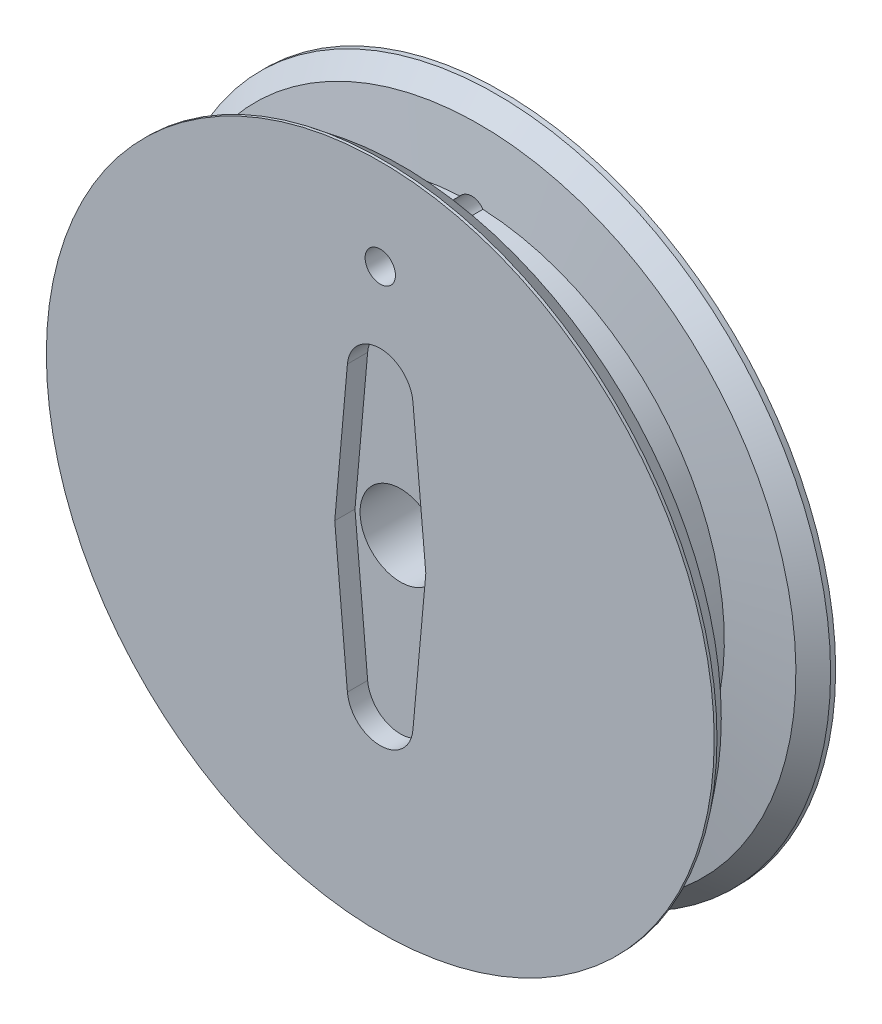
ISO-10303-21;
HEADER;
FILE_DESCRIPTION(('STEP AP214'),'2;1');
FILE_NAME('part.step','',(''),(''),'','','');
FILE_SCHEMA(('AUTOMOTIVE_DESIGN { 1 0 10303 214 1 1 1 1 }'));
ENDSEC;
DATA;
#1=APPLICATION_CONTEXT('core data for automotive mechanical design processes');
#2=APPLICATION_PROTOCOL_DEFINITION('international standard','automotive_design',2000,#1);
#3=PRODUCT_CONTEXT('',#1,'mechanical');
#4=PRODUCT('Part','Part','',(#3));
#5=PRODUCT_RELATED_PRODUCT_CATEGORY('part','',(#4));
#6=PRODUCT_DEFINITION_FORMATION('','',#4);
#7=PRODUCT_DEFINITION_CONTEXT('part definition',#1,'design');
#8=PRODUCT_DEFINITION('design','',#6,#7);
#9=PRODUCT_DEFINITION_SHAPE('','',#8);
#10=(LENGTH_UNIT() NAMED_UNIT(*) SI_UNIT(.MILLI.,.METRE.));
#11=(NAMED_UNIT(*) PLANE_ANGLE_UNIT() SI_UNIT($,.RADIAN.));
#12=(NAMED_UNIT(*) SI_UNIT($,.STERADIAN.) SOLID_ANGLE_UNIT());
#13=UNCERTAINTY_MEASURE_WITH_UNIT(LENGTH_MEASURE(1.E-05),#10,'distance_accuracy_value','');
#14=(GEOMETRIC_REPRESENTATION_CONTEXT(3) GLOBAL_UNCERTAINTY_ASSIGNED_CONTEXT((#13)) GLOBAL_UNIT_ASSIGNED_CONTEXT((#10,
#11,#12)) REPRESENTATION_CONTEXT('',''));
#15=CARTESIAN_POINT('',(0.,0.,0.));
#16=DIRECTION('',(0.,0.,1.));
#17=DIRECTION('',(1.,0.,0.));
#18=AXIS2_PLACEMENT_3D('',#15,#16,#17);
#19=CARTESIAN_POINT('',(0.,0.,-9.));
#20=DIRECTION('',(0.,0.,-1.));
#21=DIRECTION('',(1.,0.,0.));
#22=AXIS2_PLACEMENT_3D('',#19,#20,#21);
#23=CONICAL_SURFACE('',#22,25.,1.44644133224814);
#24=CARTESIAN_POINT('',(0.,0.,-9.78571428571429));
#25=DIRECTION('',(0.,0.,-1.));
#26=DIRECTION('',(-1.,0.,0.));
#27=AXIS2_PLACEMENT_3D('',#24,#25,#26);
#28=CIRCLE('',#27,31.2857142857143);
#29=CARTESIAN_POINT('',(-31.2857142857143,0.,-9.78571428571429));
#30=VERTEX_POINT('',#29);
#31=EDGE_CURVE('E110',#30,#30,#28,.T.);
#32=ORIENTED_EDGE('',*,*,#31,.F.);
#33=EDGE_LOOP('',(#32));
#34=FACE_BOUND('',#33,.T.);
#35=CARTESIAN_POINT('',(0.,0.,-9.));
#36=DIRECTION('',(0.,0.,-1.));
#37=DIRECTION('',(-1.,0.,0.));
#38=AXIS2_PLACEMENT_3D('',#35,#36,#37);
#39=CIRCLE('',#38,25.);
#40=CARTESIAN_POINT('',(1.14079146426094,24.9739583333333,-9.));
#41=VERTEX_POINT('',#40);
#42=CARTESIAN_POINT('',(-1.14079146426093,24.9739583333333,-9.));
#43=VERTEX_POINT('',#42);
#44=EDGE_CURVE('E128',#41,#43,#39,.T.);
#45=ORIENTED_EDGE('',*,*,#44,.T.);
#46=CARTESIAN_POINT('',(1.14221224438344,24.97229172,-8.9998));
#47=CARTESIAN_POINT('',(1.11497986690367,25.0042828360847,-9.00363918158181));
#48=CARTESIAN_POINT('',(1.08640729835014,25.0351245483507,-9.00733334676588));
#49=CARTESIAN_POINT('',(1.02675752938036,25.0943200766134,-9.01441217879698));
#50=CARTESIAN_POINT('',(0.995680364507312,25.1226739279041,-9.01779685003465));
#51=CARTESIAN_POINT('',(0.899043705848155,25.2036465298911,-9.02744866071762));
#52=CARTESIAN_POINT('',(0.83000261618446,25.2522659998382,-9.03322434045544));
#53=CARTESIAN_POINT('',(0.68465909844481,25.3372899282666,-9.04330384586843));
#54=CARTESIAN_POINT('',(0.608352216488604,25.3736868317178,-9.04760676122787));
#55=CARTESIAN_POINT('',(0.450659907044899,25.4331785596276,-9.05463088284024));
#56=CARTESIAN_POINT('',(0.369275846799599,25.4562769482748,-9.05735251290161));
#57=CARTESIAN_POINT('',(0.20408971927831,25.4884220230908,-9.06113816046542));
#58=CARTESIAN_POINT('',(0.120298892823023,25.4975257483435,-9.06220890665055));
#59=CARTESIAN_POINT('',(-0.0476366794566334,25.5015941563396,-9.06268755188312));
#60=CARTESIAN_POINT('',(-0.131781446504658,25.4965579787744,-9.06209534975242));
#61=CARTESIAN_POINT('',(-0.297781736777393,25.4725286688966,-9.05926674729419));
#62=CARTESIAN_POINT('',(-0.379643022020577,25.4535747465762,-9.05703496608884));
#63=CARTESIAN_POINT('',(-0.53904342146849,25.4022990633497,-9.0509864018234));
#64=CARTESIAN_POINT('',(-0.616580732776138,25.3699717729656,-9.04716896313986));
#65=CARTESIAN_POINT('',(-0.765296164565059,25.2928117916432,-9.03803429696399));
#66=CARTESIAN_POINT('',(-0.836457886371744,25.2479480098138,-9.03271334032771));
#67=CARTESIAN_POINT('',(-0.970114639775866,25.1471085224983,-9.02071507595263));
#68=CARTESIAN_POINT('',(-1.03262729614732,25.0911559969593,-9.01404059695576));
#69=CARTESIAN_POINT('',(-1.10789908944012,25.0115573442881,-9.00450945727498));
#70=CARTESIAN_POINT('',(-1.12532244620271,24.9921398851261,-9.00218194077337));
#71=CARTESIAN_POINT('',(-1.14221224438344,24.97229172,-8.9998));
#72=B_SPLINE_CURVE_WITH_KNOTS('',3,(#46,#47,#48,#49,#50,#51,#52,#53,#54,#55,#56,#57,#58,#59,#60,
#61,#62,#63,#64,#65,#66,#67,#68,#69,#70,#71),.UNSPECIFIED.,.F.,.F.,(4,2,2,2,2,2,2,2,2,2,2,2,4),
(0.,0.126485429937742,0.252969065212388,0.505585889405259,0.758358575279168,1.01106348295129,
1.26273566584856,1.51442316147279,1.76540429377413,2.01648930296785,2.26820262343231,
2.51939520861693,2.59793226541492),.UNSPECIFIED.);
#73=EDGE_CURVE('E119',#41,#43,#72,.T.);
#74=ORIENTED_EDGE('',*,*,#73,.F.);
#75=EDGE_LOOP('',(#45,#74));
#76=FACE_BOUND('',#75,.T.);
#77=ADVANCED_FACE('F41',(#34,#76),#23,.T.);
#78=CARTESIAN_POINT('',(0.,0.,0.));
#79=DIRECTION('',(0.,0.,1.));
#80=DIRECTION('',(-1.,0.,0.));
#81=AXIS2_PLACEMENT_3D('',#78,#79,#80);
#82=CYLINDRICAL_SURFACE('',#81,25.);
#83=CARTESIAN_POINT('',(0.,0.,-3.));
#84=DIRECTION('',(0.,0.,-1.));
#85=DIRECTION('',(-1.,0.,0.));
#86=AXIS2_PLACEMENT_3D('',#83,#84,#85);
#87=CIRCLE('',#86,25.);
#88=CARTESIAN_POINT('',(1.14079146426091,24.9739583333333,-3.));
#89=VERTEX_POINT('',#88);
#90=CARTESIAN_POINT('',(-1.1407914642609,24.9739583333333,-3.));
#91=VERTEX_POINT('',#90);
#92=EDGE_CURVE('E108',#89,#91,#87,.T.);
#93=ORIENTED_EDGE('',*,*,#92,.T.);
#94=DIRECTION('',(0.,0.,1.));
#95=VECTOR('',#94,1.);
#96=CARTESIAN_POINT('',(-1.14079146426093,24.9739583333333,-6.));
#97=LINE('',#96,#95);
#98=EDGE_CURVE('E114',#43,#91,#97,.T.);
#99=ORIENTED_EDGE('',*,*,#98,.F.);
#100=ORIENTED_EDGE('',*,*,#44,.F.);
#101=DIRECTION('',(0.,0.,1.));
#102=VECTOR('',#101,1.);
#103=CARTESIAN_POINT('',(1.14079146426093,24.9739583333333,-6.));
#104=LINE('',#103,#102);
#105=EDGE_CURVE('E122',#89,#41,#104,.F.);
#106=ORIENTED_EDGE('',*,*,#105,.F.);
#107=EDGE_LOOP('',(#93,#99,#100,#106));
#108=FACE_BOUND('',#107,.T.);
#109=ADVANCED_FACE('F124',(#108),#82,.T.);
#110=CARTESIAN_POINT('',(0.,0.,-2.));
#111=DIRECTION('',(0.,0.,1.));
#112=DIRECTION('',(-1.,0.,0.));
#113=AXIS2_PLACEMENT_3D('',#110,#111,#112);
#114=CONICAL_SURFACE('',#113,33.,1.44644133224813);
#115=CARTESIAN_POINT('',(0.,0.,-2.18605210188381));
#116=DIRECTION('',(0.,0.,1.));
#117=DIRECTION('',(1.,0.,0.));
#118=AXIS2_PLACEMENT_3D('',#115,#116,#117);
#119=CIRCLE('',#118,31.5115831849295);
#120=CARTESIAN_POINT('',(31.5115831849295,0.,-2.18605210188381));
#121=VERTEX_POINT('',#120);
#122=EDGE_CURVE('E11',#121,#121,#119,.T.);
#123=ORIENTED_EDGE('',*,*,#122,.F.);
#124=EDGE_LOOP('',(#123));
#125=FACE_BOUND('',#124,.T.);
#126=ORIENTED_EDGE('',*,*,#92,.F.);
#127=CARTESIAN_POINT('',(-1.14221224438344,24.97229172,-3.0002));
#128=CARTESIAN_POINT('',(-1.11497986690367,25.0042828360848,-2.9963608184182));
#129=CARTESIAN_POINT('',(-1.08640729835014,25.0351245483507,-2.99266665323413));
#130=CARTESIAN_POINT('',(-1.02675752938035,25.0943200766135,-2.98558782120302));
#131=CARTESIAN_POINT('',(-0.995680364507306,25.1226739279041,-2.98220314996536));
#132=CARTESIAN_POINT('',(-0.899043705848149,25.2036465298911,-2.97255133928238));
#133=CARTESIAN_POINT('',(-0.830002616184454,25.2522659998382,-2.96677565954456));
#134=CARTESIAN_POINT('',(-0.684659098444804,25.3372899282666,-2.95669615413158));
#135=CARTESIAN_POINT('',(-0.608352216488599,25.3736868317178,-2.95239323877214));
#136=CARTESIAN_POINT('',(-0.450659907044894,25.4331785596276,-2.94536911715977));
#137=CARTESIAN_POINT('',(-0.369275846799594,25.4562769482748,-2.94264748709839));
#138=CARTESIAN_POINT('',(-0.204089719278304,25.4884220230908,-2.93886183953458));
#139=CARTESIAN_POINT('',(-0.120298892823017,25.4975257483435,-2.93779109334945));
#140=CARTESIAN_POINT('',(0.047636679456639,25.5015941563396,-2.93731244811689));
#141=CARTESIAN_POINT('',(0.131781446504664,25.4965579787744,-2.93790465024759));
#142=CARTESIAN_POINT('',(0.297781736777398,25.4725286688966,-2.94073325270582));
#143=CARTESIAN_POINT('',(0.379643022020583,25.4535747465762,-2.94296503391117));
#144=CARTESIAN_POINT('',(0.539043421468495,25.4022990633497,-2.94901359817661));
#145=CARTESIAN_POINT('',(0.616580732776143,25.3699717729656,-2.95283103686014));
#146=CARTESIAN_POINT('',(0.765296164565063,25.2928117916432,-2.96196570303601));
#147=CARTESIAN_POINT('',(0.836457886371749,25.2479480098138,-2.9672866596723));
#148=CARTESIAN_POINT('',(0.97011463977587,25.1471085224983,-2.97928492404737));
#149=CARTESIAN_POINT('',(1.03262729614733,25.0911559969593,-2.98595940304424));
#150=CARTESIAN_POINT('',(1.10789908944012,25.0115573442881,-2.99549054272502));
#151=CARTESIAN_POINT('',(1.12532244620271,24.9921398851261,-2.99781805922663));
#152=CARTESIAN_POINT('',(1.14221224438344,24.97229172,-3.0002));
#153=B_SPLINE_CURVE_WITH_KNOTS('',3,(#127,#128,#129,#130,#131,#132,#133,#134,#135,#136,#137,
#138,#139,#140,#141,#142,#143,#144,#145,#146,#147,#148,#149,#150,#151,#152),.UNSPECIFIED.,.F.,
.F.,(4,2,2,2,2,2,2,2,2,2,2,2,4),(0.,0.126485429937743,0.252969065212389,0.505585889405258,
0.758358575279165,1.01106348295129,1.26273566584856,1.51442316147279,1.76540429377413,
2.01648930296784,2.26820262343231,2.51939520861693,2.5979322654149),.UNSPECIFIED.);
#154=EDGE_CURVE('E57',#91,#89,#153,.T.);
#155=ORIENTED_EDGE('',*,*,#154,.F.);
#156=EDGE_LOOP('',(#126,#155));
#157=FACE_BOUND('',#156,.T.);
#158=ADVANCED_FACE('F107',(#125,#157),#114,.T.);
#159=CARTESIAN_POINT('',(-33.,0.,0.));
#160=DIRECTION('',(0.,0.,1.));
#161=DIRECTION('',(-1.,0.,0.));
#162=AXIS2_PLACEMENT_3D('',#159,#160,#161);
#163=PLANE('',#162);
#164=CARTESIAN_POINT('',(0.,24.,0.));
#165=DIRECTION('',(0.,0.,1.));
#166=DIRECTION('',(1.,0.,0.));
#167=AXIS2_PLACEMENT_3D('',#164,#165,#166);
#168=CIRCLE('',#167,1.5);
#169=CARTESIAN_POINT('',(1.5,24.,0.));
#170=VERTEX_POINT('',#169);
#171=EDGE_CURVE('E404',#170,#170,#168,.T.);
#172=ORIENTED_EDGE('',*,*,#171,.F.);
#173=EDGE_LOOP('',(#172));
#174=FACE_BOUND('',#173,.T.);
#175=CARTESIAN_POINT('',(-0.011832825867151,-13.7500011355933,0.));
#176=DIRECTION('',(0.,0.,-1.));
#177=DIRECTION('',(1.,0.,0.));
#178=AXIS2_PLACEMENT_3D('',#175,#176,#177);
#179=CIRCLE('',#178,3.25);
#180=CARTESIAN_POINT('',(3.22485268695212,-14.0438835799581,0.));
#181=VERTEX_POINT('',#180);
#182=CARTESIAN_POINT('',(-3.24900516177154,-14.038471701952,0.));
#183=VERTEX_POINT('',#182);
#184=EDGE_CURVE('E171',#181,#183,#179,.T.);
#185=ORIENTED_EDGE('',*,*,#184,.T.);
#186=DIRECTION('',(-0.0887601742642085,0.996053026432121,0.));
#187=VECTOR('',#186,1.);
#188=CARTESIAN_POINT('',(-4.5,0.,0.));
#189=LINE('',#188,#187);
#190=CARTESIAN_POINT('',(-4.5,0.,0.));
#191=VERTEX_POINT('',#190);
#192=EDGE_CURVE('E192',#183,#191,#189,.T.);
#193=ORIENTED_EDGE('',*,*,#192,.T.);
#194=DIRECTION('',(0.0887601742642085,0.996053026432121,0.));
#195=VECTOR('',#194,1.);
#196=CARTESIAN_POINT('',(-4.5,0.,0.));
#197=LINE('',#196,#195);
#198=CARTESIAN_POINT('',(-3.24900516177154,14.038471701952,0.));
#199=VERTEX_POINT('',#198);
#200=EDGE_CURVE('E191',#191,#199,#197,.T.);
#201=ORIENTED_EDGE('',*,*,#200,.T.);
#202=CARTESIAN_POINT('',(-0.011832825867151,13.7500011355933,0.));
#203=DIRECTION('',(0.,0.,-1.));
#204=DIRECTION('',(-1.,0.,0.));
#205=AXIS2_PLACEMENT_3D('',#202,#203,#204);
#206=CIRCLE('',#205,3.25);
#207=CARTESIAN_POINT('',(3.22485268695212,14.0438835799581,0.));
#208=VERTEX_POINT('',#207);
#209=EDGE_CURVE('E197',#199,#208,#206,.T.);
#210=ORIENTED_EDGE('',*,*,#209,.T.);
#211=DIRECTION('',(0.0904253674968557,-0.995903234713624,0.));
#212=VECTOR('',#211,1.);
#213=CARTESIAN_POINT('',(3.22485268695212,14.0438835799581,0.));
#214=LINE('',#213,#212);
#215=CARTESIAN_POINT('',(4.5,0.,0.));
#216=VERTEX_POINT('',#215);
#217=EDGE_CURVE('E200',#208,#216,#214,.T.);
#218=ORIENTED_EDGE('',*,*,#217,.T.);
#219=DIRECTION('',(-0.0904253674968557,-0.995903234713624,0.));
#220=VECTOR('',#219,1.);
#221=CARTESIAN_POINT('',(3.22485268695212,-14.0438835799581,0.));
#222=LINE('',#221,#220);
#223=EDGE_CURVE('E177',#216,#181,#222,.T.);
#224=ORIENTED_EDGE('',*,*,#223,.T.);
#225=EDGE_LOOP('',(#185,#193,#201,#210,#218,#224));
#226=FACE_BOUND('',#225,.T.);
#227=CARTESIAN_POINT('',(0.,0.,0.));
#228=DIRECTION('',(0.,0.,-1.));
#229=DIRECTION('',(-1.,0.,0.));
#230=AXIS2_PLACEMENT_3D('',#227,#228,#229);
#231=CIRCLE('',#230,33.);
#232=CARTESIAN_POINT('',(-33.,0.,0.));
#233=VERTEX_POINT('',#232);
#234=EDGE_CURVE('E130',#233,#233,#231,.T.);
#235=ORIENTED_EDGE('',*,*,#234,.F.);
#236=EDGE_LOOP('',(#235));
#237=FACE_BOUND('',#236,.T.);
#238=ADVANCED_FACE('F148',(#174,#226,#237),#163,.T.);
#239=CARTESIAN_POINT('',(0.,0.,-12.));
#240=DIRECTION('',(0.,0.,-1.));
#241=DIRECTION('',(1.,0.,0.));
#242=AXIS2_PLACEMENT_3D('',#239,#240,#241);
#243=PLANE('',#242);
#244=CARTESIAN_POINT('',(0.,24.,-12.));
#245=DIRECTION('',(0.,0.,1.));
#246=DIRECTION('',(1.,0.,0.));
#247=AXIS2_PLACEMENT_3D('',#244,#245,#246);
#248=CIRCLE('',#247,1.5);
#249=CARTESIAN_POINT('',(1.5,24.,-12.));
#250=VERTEX_POINT('',#249);
#251=EDGE_CURVE('E121',#250,#250,#248,.T.);
#252=ORIENTED_EDGE('',*,*,#251,.T.);
#253=EDGE_LOOP('',(#252));
#254=FACE_BOUND('',#253,.T.);
#255=CARTESIAN_POINT('',(0.,0.,-12.));
#256=DIRECTION('',(0.,0.,-1.));
#257=DIRECTION('',(-1.,0.,0.));
#258=AXIS2_PLACEMENT_3D('',#255,#256,#257);
#259=CIRCLE('',#258,4.);
#260=CARTESIAN_POINT('',(-4.,0.,-12.));
#261=VERTEX_POINT('',#260);
#262=EDGE_CURVE('E169',#261,#261,#259,.T.);
#263=ORIENTED_EDGE('',*,*,#262,.F.);
#264=EDGE_LOOP('',(#263));
#265=FACE_BOUND('',#264,.T.);
#266=CARTESIAN_POINT('',(0.,0.,-12.));
#267=DIRECTION('',(0.,0.,-1.));
#268=DIRECTION('',(-1.,0.,0.));
#269=AXIS2_PLACEMENT_3D('',#266,#267,#268);
#270=CIRCLE('',#269,33.);
#271=CARTESIAN_POINT('',(-33.,0.,-12.));
#272=VERTEX_POINT('',#271);
#273=EDGE_CURVE('E112',#272,#272,#270,.T.);
#274=ORIENTED_EDGE('',*,*,#273,.T.);
#275=EDGE_LOOP('',(#274));
#276=FACE_BOUND('',#275,.T.);
#277=ADVANCED_FACE('F261',(#254,#265,#276),#243,.T.);
#278=CARTESIAN_POINT('',(0.,0.,0.));
#279=DIRECTION('',(0.,0.,1.));
#280=DIRECTION('',(-1.,0.,0.));
#281=AXIS2_PLACEMENT_3D('',#278,#279,#280);
#282=CYLINDRICAL_SURFACE('',#281,33.);
#283=CARTESIAN_POINT('',(0.,0.,-11.5));
#284=DIRECTION('',(0.,0.,-1.));
#285=DIRECTION('',(-1.,0.,0.));
#286=AXIS2_PLACEMENT_3D('',#283,#284,#285);
#287=CIRCLE('',#286,33.);
#288=CARTESIAN_POINT('',(-33.,0.,-11.5));
#289=VERTEX_POINT('',#288);
#290=EDGE_CURVE('E288',#289,#289,#287,.F.);
#291=ORIENTED_EDGE('',*,*,#290,.F.);
#292=EDGE_LOOP('',(#291));
#293=FACE_BOUND('',#292,.T.);
#294=ORIENTED_EDGE('',*,*,#273,.F.);
#295=EDGE_LOOP('',(#294));
#296=FACE_BOUND('',#295,.T.);
#297=ADVANCED_FACE('F158',(#293,#296),#282,.T.);
#298=CARTESIAN_POINT('',(0.,0.,0.));
#299=DIRECTION('',(0.,0.,1.));
#300=DIRECTION('',(-1.,0.,0.));
#301=AXIS2_PLACEMENT_3D('',#298,#299,#300);
#302=CYLINDRICAL_SURFACE('',#301,33.);
#303=CARTESIAN_POINT('',(0.,0.,-0.272373339650314));
#304=DIRECTION('',(0.,0.,1.));
#305=DIRECTION('',(1.,0.,0.));
#306=AXIS2_PLACEMENT_3D('',#303,#304,#305);
#307=CIRCLE('',#306,33.);
#308=CARTESIAN_POINT('',(33.,0.,-0.272373339650314));
#309=VERTEX_POINT('',#308);
#310=EDGE_CURVE('E47',#309,#309,#307,.F.);
#311=ORIENTED_EDGE('',*,*,#310,.F.);
#312=EDGE_LOOP('',(#311));
#313=FACE_BOUND('',#312,.T.);
#314=ORIENTED_EDGE('',*,*,#234,.T.);
#315=EDGE_LOOP('',(#314));
#316=FACE_BOUND('',#315,.T.);
#317=ADVANCED_FACE('F152',(#313,#316),#302,.T.);
#318=CARTESIAN_POINT('',(-0.011832825867151,-13.7500011355933,-2.));
#319=DIRECTION('',(0.,0.,1.));
#320=DIRECTION('',(-1.,0.,0.));
#321=AXIS2_PLACEMENT_3D('',#318,#319,#320);
#322=CYLINDRICAL_SURFACE('',#321,3.25);
#323=ORIENTED_EDGE('',*,*,#184,.F.);
#324=DIRECTION('',(0.,0.,1.));
#325=VECTOR('',#324,1.);
#326=CARTESIAN_POINT('',(3.22485268695212,-14.0438835799581,-2.));
#327=LINE('',#326,#325);
#328=CARTESIAN_POINT('',(3.22485268695212,-14.0438835799581,-2.));
#329=VERTEX_POINT('',#328);
#330=EDGE_CURVE('E131',#329,#181,#327,.T.);
#331=ORIENTED_EDGE('',*,*,#330,.F.);
#332=CARTESIAN_POINT('',(-0.011832825867151,-13.7500011355933,-2.));
#333=DIRECTION('',(0.,0.,-1.));
#334=DIRECTION('',(1.,0.,0.));
#335=AXIS2_PLACEMENT_3D('',#332,#333,#334);
#336=CIRCLE('',#335,3.25);
#337=CARTESIAN_POINT('',(-3.24900516177154,-14.038471701952,-2.));
#338=VERTEX_POINT('',#337);
#339=EDGE_CURVE('E176',#329,#338,#336,.T.);
#340=ORIENTED_EDGE('',*,*,#339,.T.);
#341=DIRECTION('',(0.,0.,1.));
#342=VECTOR('',#341,1.);
#343=CARTESIAN_POINT('',(-3.24900516177154,-14.038471701952,-2.));
#344=LINE('',#343,#342);
#345=EDGE_CURVE('E63',#338,#183,#344,.T.);
#346=ORIENTED_EDGE('',*,*,#345,.T.);
#347=EDGE_LOOP('',(#323,#331,#340,#346));
#348=FACE_BOUND('',#347,.T.);
#349=ADVANCED_FACE('F226',(#348),#322,.F.);
#350=CARTESIAN_POINT('',(3.22485268695212,-14.0438835799581,-2.));
#351=DIRECTION('',(0.995903234713624,-0.0904253674968557,0.));
#352=DIRECTION('',(0.0904253674968557,0.995903234713624,0.));
#353=AXIS2_PLACEMENT_3D('',#350,#351,#352);
#354=PLANE('',#353);
#355=ORIENTED_EDGE('',*,*,#223,.F.);
#356=DIRECTION('',(0.,0.,1.));
#357=VECTOR('',#356,1.);
#358=CARTESIAN_POINT('',(4.5,0.,-2.));
#359=LINE('',#358,#357);
#360=CARTESIAN_POINT('',(4.5,0.,-2.));
#361=VERTEX_POINT('',#360);
#362=EDGE_CURVE('E206',#361,#216,#359,.T.);
#363=ORIENTED_EDGE('',*,*,#362,.F.);
#364=DIRECTION('',(-0.0904253674968557,-0.995903234713624,0.));
#365=VECTOR('',#364,1.);
#366=CARTESIAN_POINT('',(3.22485268695212,-14.0438835799581,-2.));
#367=LINE('',#366,#365);
#368=EDGE_CURVE('E190',#361,#329,#367,.T.);
#369=ORIENTED_EDGE('',*,*,#368,.T.);
#370=ORIENTED_EDGE('',*,*,#330,.T.);
#371=EDGE_LOOP('',(#355,#363,#369,#370));
#372=FACE_BOUND('',#371,.T.);
#373=ADVANCED_FACE('F227',(#372),#354,.F.);
#374=CARTESIAN_POINT('',(3.22485268695212,14.0438835799581,-2.));
#375=DIRECTION('',(0.995903234713624,0.0904253674968557,0.));
#376=DIRECTION('',(-0.0904253674968557,0.995903234713624,0.));
#377=AXIS2_PLACEMENT_3D('',#374,#375,#376);
#378=PLANE('',#377);
#379=ORIENTED_EDGE('',*,*,#217,.F.);
#380=DIRECTION('',(0.,0.,1.));
#381=VECTOR('',#380,1.);
#382=CARTESIAN_POINT('',(3.22485268695212,14.0438835799581,-2.));
#383=LINE('',#382,#381);
#384=CARTESIAN_POINT('',(3.22485268695212,14.0438835799581,-2.));
#385=VERTEX_POINT('',#384);
#386=EDGE_CURVE('E209',#385,#208,#383,.T.);
#387=ORIENTED_EDGE('',*,*,#386,.F.);
#388=DIRECTION('',(0.0904253674968557,-0.995903234713624,0.));
#389=VECTOR('',#388,1.);
#390=CARTESIAN_POINT('',(3.22485268695212,14.0438835799581,-2.));
#391=LINE('',#390,#389);
#392=EDGE_CURVE('E184',#385,#361,#391,.T.);
#393=ORIENTED_EDGE('',*,*,#392,.T.);
#394=ORIENTED_EDGE('',*,*,#362,.T.);
#395=EDGE_LOOP('',(#379,#387,#393,#394));
#396=FACE_BOUND('',#395,.T.);
#397=ADVANCED_FACE('F241',(#396),#378,.F.);
#398=CARTESIAN_POINT('',(-0.011832825867151,13.7500011355933,-2.));
#399=DIRECTION('',(0.,0.,1.));
#400=DIRECTION('',(-1.,0.,0.));
#401=AXIS2_PLACEMENT_3D('',#398,#399,#400);
#402=CYLINDRICAL_SURFACE('',#401,3.25);
#403=ORIENTED_EDGE('',*,*,#209,.F.);
#404=DIRECTION('',(0.,0.,1.));
#405=VECTOR('',#404,1.);
#406=CARTESIAN_POINT('',(-3.24900516177154,14.038471701952,-2.));
#407=LINE('',#406,#405);
#408=CARTESIAN_POINT('',(-3.24900516177154,14.038471701952,-2.));
#409=VERTEX_POINT('',#408);
#410=EDGE_CURVE('E210',#409,#199,#407,.T.);
#411=ORIENTED_EDGE('',*,*,#410,.F.);
#412=CARTESIAN_POINT('',(-0.011832825867151,13.7500011355933,-2.));
#413=DIRECTION('',(0.,0.,-1.));
#414=DIRECTION('',(-1.,0.,0.));
#415=AXIS2_PLACEMENT_3D('',#412,#413,#414);
#416=CIRCLE('',#415,3.25);
#417=EDGE_CURVE('E183',#409,#385,#416,.T.);
#418=ORIENTED_EDGE('',*,*,#417,.T.);
#419=ORIENTED_EDGE('',*,*,#386,.T.);
#420=EDGE_LOOP('',(#403,#411,#418,#419));
#421=FACE_BOUND('',#420,.T.);
#422=ADVANCED_FACE('F239',(#421),#402,.F.);
#423=CARTESIAN_POINT('',(-4.5,0.,-2.));
#424=DIRECTION('',(-0.996053026432121,0.0887601742642085,0.));
#425=DIRECTION('',(-0.0887601742642086,-0.996053026432121,0.));
#426=AXIS2_PLACEMENT_3D('',#423,#424,#425);
#427=PLANE('',#426);
#428=ORIENTED_EDGE('',*,*,#200,.F.);
#429=DIRECTION('',(0.,0.,1.));
#430=VECTOR('',#429,1.);
#431=CARTESIAN_POINT('',(-4.5,0.,-2.));
#432=LINE('',#431,#430);
#433=CARTESIAN_POINT('',(-4.5,0.,-2.));
#434=VERTEX_POINT('',#433);
#435=EDGE_CURVE('E212',#434,#191,#432,.T.);
#436=ORIENTED_EDGE('',*,*,#435,.F.);
#437=DIRECTION('',(0.0887601742642085,0.996053026432121,0.));
#438=VECTOR('',#437,1.);
#439=CARTESIAN_POINT('',(-4.5,0.,-2.));
#440=LINE('',#439,#438);
#441=EDGE_CURVE('E181',#434,#409,#440,.T.);
#442=ORIENTED_EDGE('',*,*,#441,.T.);
#443=ORIENTED_EDGE('',*,*,#410,.T.);
#444=EDGE_LOOP('',(#428,#436,#442,#443));
#445=FACE_BOUND('',#444,.T.);
#446=ADVANCED_FACE('F219',(#445),#427,.F.);
#447=CARTESIAN_POINT('',(-4.5,0.,-2.));
#448=DIRECTION('',(-0.996053026432121,-0.0887601742642085,0.));
#449=DIRECTION('',(0.0887601742642086,-0.996053026432121,0.));
#450=AXIS2_PLACEMENT_3D('',#447,#448,#449);
#451=PLANE('',#450);
#452=ORIENTED_EDGE('',*,*,#192,.F.);
#453=ORIENTED_EDGE('',*,*,#345,.F.);
#454=DIRECTION('',(-0.0887601742642085,0.996053026432121,0.));
#455=VECTOR('',#454,1.);
#456=CARTESIAN_POINT('',(-4.5,0.,-2.));
#457=LINE('',#456,#455);
#458=EDGE_CURVE('E178',#338,#434,#457,.T.);
#459=ORIENTED_EDGE('',*,*,#458,.T.);
#460=ORIENTED_EDGE('',*,*,#435,.T.);
#461=EDGE_LOOP('',(#452,#453,#459,#460));
#462=FACE_BOUND('',#461,.T.);
#463=ADVANCED_FACE('F218',(#462),#451,.F.);
#464=CARTESIAN_POINT('',(-0.011832825867151,-13.7500011355933,-2.));
#465=DIRECTION('',(0.,0.,-1.));
#466=DIRECTION('',(1.,0.,0.));
#467=AXIS2_PLACEMENT_3D('',#464,#465,#466);
#468=PLANE('',#467);
#469=CARTESIAN_POINT('',(0.,0.,-2.));
#470=DIRECTION('',(0.,0.,-1.));
#471=DIRECTION('',(-1.,0.,0.));
#472=AXIS2_PLACEMENT_3D('',#469,#470,#471);
#473=CIRCLE('',#472,4.);
#474=CARTESIAN_POINT('',(-4.,0.,-2.));
#475=VERTEX_POINT('',#474);
#476=EDGE_CURVE('E170',#475,#475,#473,.T.);
#477=ORIENTED_EDGE('',*,*,#476,.T.);
#478=EDGE_LOOP('',(#477));
#479=FACE_BOUND('',#478,.T.);
#480=ORIENTED_EDGE('',*,*,#339,.F.);
#481=ORIENTED_EDGE('',*,*,#368,.F.);
#482=ORIENTED_EDGE('',*,*,#392,.F.);
#483=ORIENTED_EDGE('',*,*,#417,.F.);
#484=ORIENTED_EDGE('',*,*,#441,.F.);
#485=ORIENTED_EDGE('',*,*,#458,.F.);
#486=EDGE_LOOP('',(#480,#481,#482,#483,#484,#485));
#487=FACE_BOUND('',#486,.T.);
#488=ADVANCED_FACE('F233',(#479,#487),#468,.F.);
#489=CARTESIAN_POINT('',(0.,0.,-12.));
#490=DIRECTION('',(0.,0.,1.));
#491=DIRECTION('',(-1.,0.,0.));
#492=AXIS2_PLACEMENT_3D('',#489,#490,#491);
#493=CYLINDRICAL_SURFACE('',#492,4.);
#494=ORIENTED_EDGE('',*,*,#262,.T.);
#495=EDGE_LOOP('',(#494));
#496=FACE_BOUND('',#495,.T.);
#497=ORIENTED_EDGE('',*,*,#476,.F.);
#498=EDGE_LOOP('',(#497));
#499=FACE_BOUND('',#498,.T.);
#500=ADVANCED_FACE('F283',(#496,#499),#493,.F.);
#501=CARTESIAN_POINT('',(0.,24.,-12.));
#502=DIRECTION('',(0.,0.,1.));
#503=DIRECTION('',(-1.,0.,0.));
#504=AXIS2_PLACEMENT_3D('',#501,#502,#503);
#505=CYLINDRICAL_SURFACE('',#504,1.5);
#506=ORIENTED_EDGE('',*,*,#105,.T.);
#507=ORIENTED_EDGE('',*,*,#73,.T.);
#508=ORIENTED_EDGE('',*,*,#98,.T.);
#509=ORIENTED_EDGE('',*,*,#154,.T.);
#510=EDGE_LOOP('',(#506,#507,#508,#509));
#511=FACE_BOUND('',#510,.T.);
#512=ORIENTED_EDGE('',*,*,#251,.F.);
#513=EDGE_LOOP('',(#512));
#514=FACE_BOUND('',#513,.T.);
#515=ORIENTED_EDGE('',*,*,#171,.T.);
#516=EDGE_LOOP('',(#515));
#517=FACE_BOUND('',#516,.T.);
#518=ADVANCED_FACE('F113',(#511,#514,#517),#505,.F.);
#519=CARTESIAN_POINT('',(0.,0.,-9.78571428571429));
#520=DIRECTION('',(0.,0.,-1.));
#521=DIRECTION('',(1.,0.,0.));
#522=AXIS2_PLACEMENT_3D('',#519,#520,#521);
#523=CONICAL_SURFACE('',#522,31.2857142857143,0.785398163397448);
#524=ORIENTED_EDGE('',*,*,#290,.T.);
#525=EDGE_LOOP('',(#524));
#526=FACE_BOUND('',#525,.T.);
#527=ORIENTED_EDGE('',*,*,#31,.T.);
#528=EDGE_LOOP('',(#527));
#529=FACE_BOUND('',#528,.T.);
#530=ADVANCED_FACE('F280',(#526,#529),#523,.T.);
#531=CARTESIAN_POINT('',(0.,0.,-0.272373339650314));
#532=DIRECTION('',(0.,0.,1.));
#533=DIRECTION('',(-1.,0.,0.));
#534=AXIS2_PLACEMENT_3D('',#531,#532,#533);
#535=CONICAL_SURFACE('',#534,33.,0.661043168850686);
#536=ORIENTED_EDGE('',*,*,#122,.T.);
#537=EDGE_LOOP('',(#536));
#538=FACE_BOUND('',#537,.T.);
#539=ORIENTED_EDGE('',*,*,#310,.T.);
#540=EDGE_LOOP('',(#539));
#541=FACE_BOUND('',#540,.T.);
#542=ADVANCED_FACE('F43',(#538,#541),#535,.T.);
#543=CLOSED_SHELL('',(#77,#109,#158,#238,#277,#297,#317,#349,#373,#397,#422,#446,#463,#488,#500,
#518,#530,#542));
#544=MANIFOLD_SOLID_BREP('B2',#543);
#545=ADVANCED_BREP_SHAPE_REPRESENTATION('',(#18,#544),#14);
#546=SHAPE_DEFINITION_REPRESENTATION(#9,#545);
ENDSEC;
END-ISO-10303-21;
